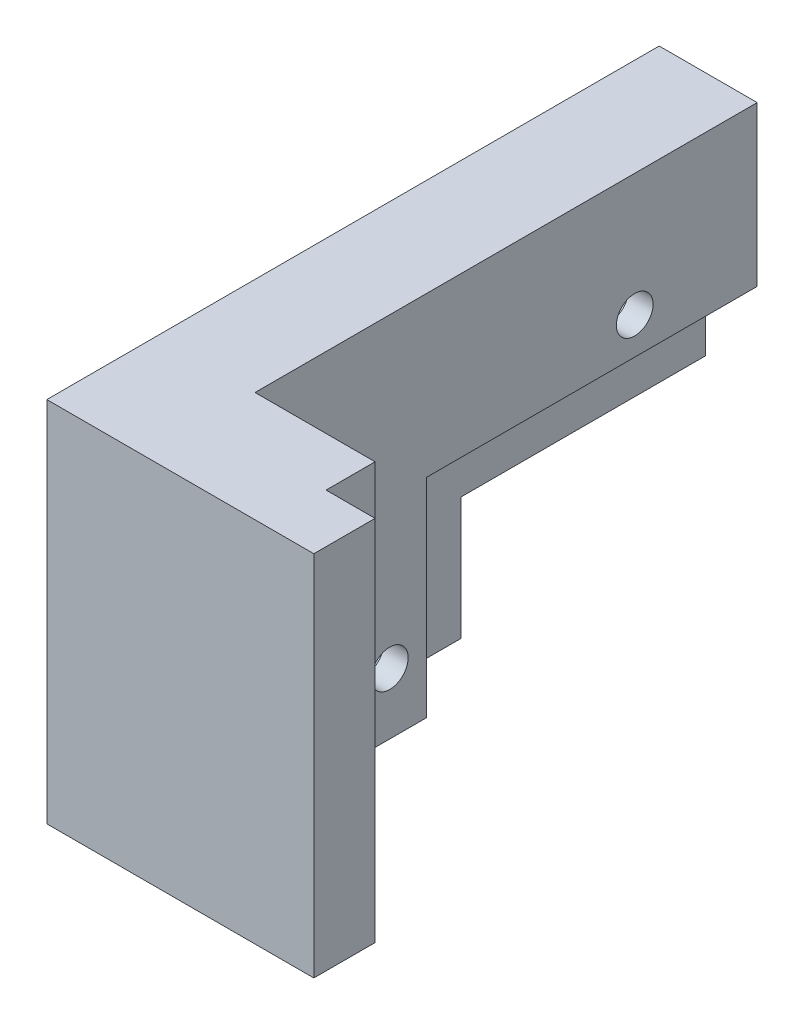
ISO-10303-21;
HEADER;
FILE_DESCRIPTION(('STEP AP214'),'2;1');
FILE_NAME('part.step','',(''),(''),'','','');
FILE_SCHEMA(('AUTOMOTIVE_DESIGN { 1 0 10303 214 1 1 1 1 }'));
ENDSEC;
DATA;
#1=APPLICATION_CONTEXT('core data for automotive mechanical design processes');
#2=APPLICATION_PROTOCOL_DEFINITION('international standard','automotive_design',2000,#1);
#3=PRODUCT_CONTEXT('',#1,'mechanical');
#4=PRODUCT('Part','Part','',(#3));
#5=PRODUCT_RELATED_PRODUCT_CATEGORY('part','',(#4));
#6=PRODUCT_DEFINITION_FORMATION('','',#4);
#7=PRODUCT_DEFINITION_CONTEXT('part definition',#1,'design');
#8=PRODUCT_DEFINITION('design','',#6,#7);
#9=PRODUCT_DEFINITION_SHAPE('','',#8);
#10=(LENGTH_UNIT() NAMED_UNIT(*) SI_UNIT(.MILLI.,.METRE.));
#11=(NAMED_UNIT(*) PLANE_ANGLE_UNIT() SI_UNIT($,.RADIAN.));
#12=(NAMED_UNIT(*) SI_UNIT($,.STERADIAN.) SOLID_ANGLE_UNIT());
#13=UNCERTAINTY_MEASURE_WITH_UNIT(LENGTH_MEASURE(1.E-05),#10,'distance_accuracy_value','');
#14=(GEOMETRIC_REPRESENTATION_CONTEXT(3) GLOBAL_UNCERTAINTY_ASSIGNED_CONTEXT((#13)) GLOBAL_UNIT_ASSIGNED_CONTEXT((#10,
#11,#12)) REPRESENTATION_CONTEXT('',''));
#15=CARTESIAN_POINT('',(0.,0.,0.));
#16=DIRECTION('',(0.,0.,1.));
#17=DIRECTION('',(1.,0.,0.));
#18=AXIS2_PLACEMENT_3D('',#15,#16,#17);
#19=CARTESIAN_POINT('',(0.,0.,0.));
#20=DIRECTION('',(0.,0.,1.));
#21=DIRECTION('',(1.,0.,0.));
#22=AXIS2_PLACEMENT_3D('',#19,#20,#21);
#23=PLANE('',#22);
#24=DIRECTION('',(0.,-1.,0.));
#25=VECTOR('',#24,1.);
#26=CARTESIAN_POINT('',(-26.2,0.,0.));
#27=LINE('',#26,#25);
#28=CARTESIAN_POINT('',(-26.2,30.,0.));
#29=VERTEX_POINT('',#28);
#30=CARTESIAN_POINT('',(-26.2,0.,0.));
#31=VERTEX_POINT('',#30);
#32=EDGE_CURVE('E136',#29,#31,#27,.T.);
#33=ORIENTED_EDGE('',*,*,#32,.T.);
#34=DIRECTION('',(1.,0.,0.));
#35=VECTOR('',#34,1.);
#36=CARTESIAN_POINT('',(0.,0.,0.));
#37=LINE('',#36,#35);
#38=CARTESIAN_POINT('',(-30.2,0.,0.));
#39=VERTEX_POINT('',#38);
#40=EDGE_CURVE('E151',#39,#31,#37,.T.);
#41=ORIENTED_EDGE('',*,*,#40,.F.);
#42=DIRECTION('',(0.,-1.,0.));
#43=VECTOR('',#42,1.);
#44=CARTESIAN_POINT('',(-30.2,30.,0.));
#45=LINE('',#44,#43);
#46=CARTESIAN_POINT('',(-30.2,30.,0.));
#47=VERTEX_POINT('',#46);
#48=EDGE_CURVE('E149',#47,#39,#45,.T.);
#49=ORIENTED_EDGE('',*,*,#48,.F.);
#50=DIRECTION('',(-1.,0.,0.));
#51=VECTOR('',#50,1.);
#52=CARTESIAN_POINT('',(0.,30.,0.));
#53=LINE('',#52,#51);
#54=EDGE_CURVE('E64',#29,#47,#53,.T.);
#55=ORIENTED_EDGE('',*,*,#54,.F.);
#56=EDGE_LOOP('',(#33,#41,#49,#55));
#57=FACE_BOUND('',#56,.T.);
#58=ADVANCED_FACE('F40',(#57),#23,.F.);
#59=CARTESIAN_POINT('',(0.,30.,5.));
#60=DIRECTION('',(0.,-1.,0.));
#61=DIRECTION('',(1.,0.,0.));
#62=AXIS2_PLACEMENT_3D('',#59,#60,#61);
#63=PLANE('',#62);
#64=DIRECTION('',(0.,0.,-1.));
#65=VECTOR('',#64,1.);
#66=CARTESIAN_POINT('',(-26.2,30.,0.));
#67=LINE('',#66,#65);
#68=CARTESIAN_POINT('',(-26.2,30.,5.));
#69=VERTEX_POINT('',#68);
#70=EDGE_CURVE('E57',#69,#29,#67,.T.);
#71=ORIENTED_EDGE('',*,*,#70,.T.);
#72=ORIENTED_EDGE('',*,*,#54,.T.);
#73=DIRECTION('',(0.,0.,1.));
#74=VECTOR('',#73,1.);
#75=CARTESIAN_POINT('',(-30.2,30.,0.));
#76=LINE('',#75,#74);
#77=CARTESIAN_POINT('',(-30.2,30.,-4.));
#78=VERTEX_POINT('',#77);
#79=EDGE_CURVE('E248',#78,#47,#76,.T.);
#80=ORIENTED_EDGE('',*,*,#79,.F.);
#81=DIRECTION('',(-1.,0.,0.));
#82=VECTOR('',#81,1.);
#83=CARTESIAN_POINT('',(-30.2,30.,-4.));
#84=LINE('',#83,#82);
#85=CARTESIAN_POINT('',(-40.,30.,-4.));
#86=VERTEX_POINT('',#85);
#87=EDGE_CURVE('E250',#78,#86,#84,.T.);
#88=ORIENTED_EDGE('',*,*,#87,.T.);
#89=DIRECTION('',(0.,0.,1.));
#90=VECTOR('',#89,1.);
#91=CARTESIAN_POINT('',(-40.,30.,-5.));
#92=LINE('',#91,#90);
#93=CARTESIAN_POINT('',(-40.,30.,-45.));
#94=VERTEX_POINT('',#93);
#95=EDGE_CURVE('E152',#94,#86,#92,.T.);
#96=ORIENTED_EDGE('',*,*,#95,.F.);
#97=DIRECTION('',(1.,0.,0.));
#98=VECTOR('',#97,1.);
#99=CARTESIAN_POINT('',(-48.,30.,-45.));
#100=LINE('',#99,#98);
#101=CARTESIAN_POINT('',(-48.,30.,-45.));
#102=VERTEX_POINT('',#101);
#103=EDGE_CURVE('E199',#102,#94,#100,.T.);
#104=ORIENTED_EDGE('',*,*,#103,.F.);
#105=DIRECTION('',(0.,0.,-1.));
#106=VECTOR('',#105,1.);
#107=CARTESIAN_POINT('',(-48.,30.,5.));
#108=LINE('',#107,#106);
#109=CARTESIAN_POINT('',(-48.,30.,5.));
#110=VERTEX_POINT('',#109);
#111=EDGE_CURVE('E182',#110,#102,#108,.T.);
#112=ORIENTED_EDGE('',*,*,#111,.F.);
#113=DIRECTION('',(-1.,0.,0.));
#114=VECTOR('',#113,1.);
#115=CARTESIAN_POINT('',(0.,30.,5.));
#116=LINE('',#115,#114);
#117=EDGE_CURVE('E49',#69,#110,#116,.T.);
#118=ORIENTED_EDGE('',*,*,#117,.F.);
#119=EDGE_LOOP('',(#71,#72,#80,#88,#96,#104,#112,#118));
#120=FACE_BOUND('',#119,.T.);
#121=ADVANCED_FACE('F42',(#120),#63,.F.);
#122=CARTESIAN_POINT('',(0.,0.,5.));
#123=DIRECTION('',(0.,1.,0.));
#124=DIRECTION('',(-1.,0.,0.));
#125=AXIS2_PLACEMENT_3D('',#122,#123,#124);
#126=PLANE('',#125);
#127=DIRECTION('',(0.,0.,1.));
#128=VECTOR('',#127,1.);
#129=CARTESIAN_POINT('',(-26.2,0.,5.));
#130=LINE('',#129,#128);
#131=CARTESIAN_POINT('',(-26.2,0.,5.));
#132=VERTEX_POINT('',#131);
#133=EDGE_CURVE('E139',#31,#132,#130,.T.);
#134=ORIENTED_EDGE('',*,*,#133,.T.);
#135=DIRECTION('',(1.,0.,0.));
#136=VECTOR('',#135,1.);
#137=CARTESIAN_POINT('',(0.,0.,5.));
#138=LINE('',#137,#136);
#139=CARTESIAN_POINT('',(-48.,0.,5.));
#140=VERTEX_POINT('',#139);
#141=EDGE_CURVE('E13',#140,#132,#138,.T.);
#142=ORIENTED_EDGE('',*,*,#141,.F.);
#143=DIRECTION('',(0.,0.,1.));
#144=VECTOR('',#143,1.);
#145=CARTESIAN_POINT('',(-48.,0.,-25.));
#146=LINE('',#145,#144);
#147=CARTESIAN_POINT('',(-48.,0.,-25.));
#148=VERTEX_POINT('',#147);
#149=EDGE_CURVE('E165',#148,#140,#146,.T.);
#150=ORIENTED_EDGE('',*,*,#149,.F.);
#151=DIRECTION('',(-1.,0.,0.));
#152=VECTOR('',#151,1.);
#153=CARTESIAN_POINT('',(-40.,0.,-25.));
#154=LINE('',#153,#152);
#155=CARTESIAN_POINT('',(-44.2,0.,-25.));
#156=VERTEX_POINT('',#155);
#157=EDGE_CURVE('E187',#156,#148,#154,.T.);
#158=ORIENTED_EDGE('',*,*,#157,.F.);
#159=DIRECTION('',(0.,0.,-1.));
#160=VECTOR('',#159,1.);
#161=CARTESIAN_POINT('',(-44.2,0.,-18.));
#162=LINE('',#161,#160);
#163=CARTESIAN_POINT('',(-44.2,0.,-18.));
#164=VERTEX_POINT('',#163);
#165=EDGE_CURVE('E238',#164,#156,#162,.T.);
#166=ORIENTED_EDGE('',*,*,#165,.F.);
#167=DIRECTION('',(1.,0.,0.));
#168=VECTOR('',#167,1.);
#169=CARTESIAN_POINT('',(-44.2,0.,-18.));
#170=LINE('',#169,#168);
#171=CARTESIAN_POINT('',(-40.,0.,-18.));
#172=VERTEX_POINT('',#171);
#173=EDGE_CURVE('E216',#164,#172,#170,.T.);
#174=ORIENTED_EDGE('',*,*,#173,.T.);
#175=DIRECTION('',(0.,0.,1.));
#176=VECTOR('',#175,1.);
#177=CARTESIAN_POINT('',(-40.,0.,-5.));
#178=LINE('',#177,#176);
#179=CARTESIAN_POINT('',(-40.,0.,-4.));
#180=VERTEX_POINT('',#179);
#181=EDGE_CURVE('E155',#172,#180,#178,.T.);
#182=ORIENTED_EDGE('',*,*,#181,.T.);
#183=DIRECTION('',(-1.,0.,0.));
#184=VECTOR('',#183,1.);
#185=CARTESIAN_POINT('',(-30.2,0.,-4.));
#186=LINE('',#185,#184);
#187=CARTESIAN_POINT('',(-30.2,0.,-4.));
#188=VERTEX_POINT('',#187);
#189=EDGE_CURVE('E254',#188,#180,#186,.T.);
#190=ORIENTED_EDGE('',*,*,#189,.F.);
#191=DIRECTION('',(0.,0.,-1.));
#192=VECTOR('',#191,1.);
#193=CARTESIAN_POINT('',(-30.2,0.,0.));
#194=LINE('',#193,#192);
#195=EDGE_CURVE('E244',#39,#188,#194,.T.);
#196=ORIENTED_EDGE('',*,*,#195,.F.);
#197=ORIENTED_EDGE('',*,*,#40,.T.);
#198=EDGE_LOOP('',(#134,#142,#150,#158,#166,#174,#182,#190,#196,#197));
#199=FACE_BOUND('',#198,.T.);
#200=ADVANCED_FACE('F236',(#199),#126,.F.);
#201=CARTESIAN_POINT('',(0.,0.,5.));
#202=DIRECTION('',(0.,0.,1.));
#203=DIRECTION('',(1.,0.,0.));
#204=AXIS2_PLACEMENT_3D('',#201,#202,#203);
#205=PLANE('',#204);
#206=ORIENTED_EDGE('',*,*,#141,.T.);
#207=DIRECTION('',(0.,1.,0.));
#208=VECTOR('',#207,1.);
#209=CARTESIAN_POINT('',(-26.2,30.,5.));
#210=LINE('',#209,#208);
#211=EDGE_CURVE('E146',#132,#69,#210,.T.);
#212=ORIENTED_EDGE('',*,*,#211,.T.);
#213=ORIENTED_EDGE('',*,*,#117,.T.);
#214=DIRECTION('',(0.,1.,0.));
#215=VECTOR('',#214,1.);
#216=CARTESIAN_POINT('',(-48.,0.,5.));
#217=LINE('',#216,#215);
#218=EDGE_CURVE('E179',#140,#110,#217,.T.);
#219=ORIENTED_EDGE('',*,*,#218,.F.);
#220=EDGE_LOOP('',(#206,#212,#213,#219));
#221=FACE_BOUND('',#220,.T.);
#222=ADVANCED_FACE('F192',(#221),#205,.T.);
#223=CARTESIAN_POINT('',(-40.,30.,-5.));
#224=DIRECTION('',(-1.,0.,0.));
#225=DIRECTION('',(0.,0.,1.));
#226=AXIS2_PLACEMENT_3D('',#223,#224,#225);
#227=PLANE('',#226);
#228=CARTESIAN_POINT('',(-40.,5.,-15.));
#229=DIRECTION('',(-1.,0.,0.));
#230=DIRECTION('',(0.,0.,1.));
#231=AXIS2_PLACEMENT_3D('',#228,#229,#230);
#232=CIRCLE('',#231,1.5);
#233=CARTESIAN_POINT('',(-40.,5.,-13.5));
#234=VERTEX_POINT('',#233);
#235=EDGE_CURVE('E160',#234,#234,#232,.T.);
#236=ORIENTED_EDGE('',*,*,#235,.T.);
#237=EDGE_LOOP('',(#236));
#238=FACE_BOUND('',#237,.T.);
#239=CARTESIAN_POINT('',(-40.,20.,-35.));
#240=DIRECTION('',(-1.,0.,0.));
#241=DIRECTION('',(0.,0.,1.));
#242=AXIS2_PLACEMENT_3D('',#239,#240,#241);
#243=CIRCLE('',#242,1.5);
#244=CARTESIAN_POINT('',(-40.,20.,-33.5));
#245=VERTEX_POINT('',#244);
#246=EDGE_CURVE('E263',#245,#245,#243,.T.);
#247=ORIENTED_EDGE('',*,*,#246,.T.);
#248=EDGE_LOOP('',(#247));
#249=FACE_BOUND('',#248,.T.);
#250=DIRECTION('',(0.,1.,0.));
#251=VECTOR('',#250,1.);
#252=CARTESIAN_POINT('',(-40.,30.,-4.));
#253=LINE('',#252,#251);
#254=EDGE_CURVE('E142',#180,#86,#253,.T.);
#255=ORIENTED_EDGE('',*,*,#254,.F.);
#256=ORIENTED_EDGE('',*,*,#181,.F.);
#257=DIRECTION('',(0.,-1.,0.));
#258=VECTOR('',#257,1.);
#259=CARTESIAN_POINT('',(-40.,10.,-18.));
#260=LINE('',#259,#258);
#261=CARTESIAN_POINT('',(-40.,17.,-18.));
#262=VERTEX_POINT('',#261);
#263=EDGE_CURVE('E271',#262,#172,#260,.T.);
#264=ORIENTED_EDGE('',*,*,#263,.F.);
#265=DIRECTION('',(0.,0.,1.));
#266=VECTOR('',#265,1.);
#267=CARTESIAN_POINT('',(-40.,17.,-45.));
#268=LINE('',#267,#266);
#269=CARTESIAN_POINT('',(-40.,17.,-45.));
#270=VERTEX_POINT('',#269);
#271=EDGE_CURVE('E266',#270,#262,#268,.T.);
#272=ORIENTED_EDGE('',*,*,#271,.F.);
#273=DIRECTION('',(0.,-1.,0.));
#274=VECTOR('',#273,1.);
#275=CARTESIAN_POINT('',(-40.,30.,-45.));
#276=LINE('',#275,#274);
#277=EDGE_CURVE('E205',#94,#270,#276,.T.);
#278=ORIENTED_EDGE('',*,*,#277,.F.);
#279=ORIENTED_EDGE('',*,*,#95,.T.);
#280=EDGE_LOOP('',(#255,#256,#264,#272,#278,#279));
#281=FACE_BOUND('',#280,.T.);
#282=ADVANCED_FACE('F291',(#238,#249,#281),#227,.F.);
#283=CARTESIAN_POINT('',(-33.8,20.,-35.));
#284=DIRECTION('',(-1.,0.,0.));
#285=DIRECTION('',(0.,0.,1.));
#286=AXIS2_PLACEMENT_3D('',#283,#284,#285);
#287=CYLINDRICAL_SURFACE('',#286,1.5);
#288=ORIENTED_EDGE('',*,*,#246,.F.);
#289=EDGE_LOOP('',(#288));
#290=FACE_BOUND('',#289,.T.);
#291=CARTESIAN_POINT('',(-42.,20.,-35.));
#292=DIRECTION('',(-1.,0.,0.));
#293=DIRECTION('',(0.,0.,1.));
#294=AXIS2_PLACEMENT_3D('',#291,#292,#293);
#295=CIRCLE('',#294,1.5);
#296=CARTESIAN_POINT('',(-42.,20.,-33.5));
#297=VERTEX_POINT('',#296);
#298=EDGE_CURVE('E44',#297,#297,#295,.F.);
#299=ORIENTED_EDGE('',*,*,#298,.F.);
#300=EDGE_LOOP('',(#299));
#301=FACE_BOUND('',#300,.T.);
#302=ADVANCED_FACE('F327',(#290,#301),#287,.F.);
#303=CARTESIAN_POINT('',(0.,0.,-25.));
#304=DIRECTION('',(0.,0.,-1.));
#305=DIRECTION('',(-1.,0.,0.));
#306=AXIS2_PLACEMENT_3D('',#303,#304,#305);
#307=PLANE('',#306);
#308=DIRECTION('',(-1.,0.,0.));
#309=VECTOR('',#308,1.);
#310=CARTESIAN_POINT('',(-48.,10.,-25.));
#311=LINE('',#310,#309);
#312=CARTESIAN_POINT('',(-44.2,10.,-25.));
#313=VERTEX_POINT('',#312);
#314=CARTESIAN_POINT('',(-48.,10.,-25.));
#315=VERTEX_POINT('',#314);
#316=EDGE_CURVE('E214',#313,#315,#311,.T.);
#317=ORIENTED_EDGE('',*,*,#316,.F.);
#318=DIRECTION('',(0.,1.,0.));
#319=VECTOR('',#318,1.);
#320=CARTESIAN_POINT('',(-44.2,10.,-25.));
#321=LINE('',#320,#319);
#322=EDGE_CURVE('E233',#156,#313,#321,.T.);
#323=ORIENTED_EDGE('',*,*,#322,.F.);
#324=ORIENTED_EDGE('',*,*,#157,.T.);
#325=DIRECTION('',(0.,-1.,0.));
#326=VECTOR('',#325,1.);
#327=CARTESIAN_POINT('',(-48.,30.,-25.));
#328=LINE('',#327,#326);
#329=EDGE_CURVE('E184',#315,#148,#328,.T.);
#330=ORIENTED_EDGE('',*,*,#329,.F.);
#331=EDGE_LOOP('',(#317,#323,#324,#330));
#332=FACE_BOUND('',#331,.T.);
#333=ADVANCED_FACE('F231',(#332),#307,.T.);
#334=CARTESIAN_POINT('',(-48.,10.,-45.));
#335=DIRECTION('',(0.,1.,0.));
#336=DIRECTION('',(-1.,0.,0.));
#337=AXIS2_PLACEMENT_3D('',#334,#335,#336);
#338=PLANE('',#337);
#339=DIRECTION('',(0.,0.,-1.));
#340=VECTOR('',#339,1.);
#341=CARTESIAN_POINT('',(-44.2,10.,-45.));
#342=LINE('',#341,#340);
#343=CARTESIAN_POINT('',(-44.2,10.,-45.));
#344=VERTEX_POINT('',#343);
#345=EDGE_CURVE('E228',#313,#344,#342,.T.);
#346=ORIENTED_EDGE('',*,*,#345,.F.);
#347=ORIENTED_EDGE('',*,*,#316,.T.);
#348=DIRECTION('',(0.,0.,1.));
#349=VECTOR('',#348,1.);
#350=CARTESIAN_POINT('',(-48.,10.,-45.));
#351=LINE('',#350,#349);
#352=CARTESIAN_POINT('',(-48.,10.,-45.));
#353=VERTEX_POINT('',#352);
#354=EDGE_CURVE('E173',#353,#315,#351,.T.);
#355=ORIENTED_EDGE('',*,*,#354,.F.);
#356=DIRECTION('',(-1.,0.,0.));
#357=VECTOR('',#356,1.);
#358=CARTESIAN_POINT('',(-48.,10.,-45.));
#359=LINE('',#358,#357);
#360=EDGE_CURVE('E211',#344,#353,#359,.T.);
#361=ORIENTED_EDGE('',*,*,#360,.F.);
#362=EDGE_LOOP('',(#346,#347,#355,#361));
#363=FACE_BOUND('',#362,.T.);
#364=ADVANCED_FACE('F226',(#363),#338,.F.);
#365=CARTESIAN_POINT('',(-35.,5.,-15.));
#366=DIRECTION('',(-1.,0.,0.));
#367=DIRECTION('',(0.,0.,1.));
#368=AXIS2_PLACEMENT_3D('',#365,#366,#367);
#369=CYLINDRICAL_SURFACE('',#368,1.5);
#370=ORIENTED_EDGE('',*,*,#235,.F.);
#371=EDGE_LOOP('',(#370));
#372=FACE_BOUND('',#371,.T.);
#373=CARTESIAN_POINT('',(-42.,5.,-15.));
#374=DIRECTION('',(-1.,0.,0.));
#375=DIRECTION('',(0.,0.,1.));
#376=AXIS2_PLACEMENT_3D('',#373,#374,#375);
#377=CIRCLE('',#376,1.5);
#378=CARTESIAN_POINT('',(-42.,5.,-13.5));
#379=VERTEX_POINT('',#378);
#380=EDGE_CURVE('E158',#379,#379,#377,.F.);
#381=ORIENTED_EDGE('',*,*,#380,.F.);
#382=EDGE_LOOP('',(#381));
#383=FACE_BOUND('',#382,.T.);
#384=ADVANCED_FACE('F343',(#372,#383),#369,.F.);
#385=CARTESIAN_POINT('',(-48.,0.,0.));
#386=DIRECTION('',(-1.,0.,0.));
#387=DIRECTION('',(0.,0.,1.));
#388=AXIS2_PLACEMENT_3D('',#385,#386,#387);
#389=PLANE('',#388);
#390=CARTESIAN_POINT('',(-48.,20.,-35.));
#391=DIRECTION('',(-1.,0.,0.));
#392=DIRECTION('',(0.,0.,1.));
#393=AXIS2_PLACEMENT_3D('',#390,#391,#392);
#394=CIRCLE('',#393,2.9);
#395=CARTESIAN_POINT('',(-48.,20.,-32.1));
#396=VERTEX_POINT('',#395);
#397=EDGE_CURVE('E257',#396,#396,#394,.T.);
#398=ORIENTED_EDGE('',*,*,#397,.F.);
#399=EDGE_LOOP('',(#398));
#400=FACE_BOUND('',#399,.T.);
#401=CARTESIAN_POINT('',(-48.,5.,-15.));
#402=DIRECTION('',(-1.,0.,0.));
#403=DIRECTION('',(0.,0.,1.));
#404=AXIS2_PLACEMENT_3D('',#401,#402,#403);
#405=CIRCLE('',#404,2.9);
#406=CARTESIAN_POINT('',(-48.,5.,-12.1));
#407=VERTEX_POINT('',#406);
#408=EDGE_CURVE('E168',#407,#407,#405,.T.);
#409=ORIENTED_EDGE('',*,*,#408,.F.);
#410=EDGE_LOOP('',(#409));
#411=FACE_BOUND('',#410,.T.);
#412=ORIENTED_EDGE('',*,*,#149,.T.);
#413=ORIENTED_EDGE('',*,*,#218,.T.);
#414=ORIENTED_EDGE('',*,*,#111,.T.);
#415=DIRECTION('',(0.,1.,0.));
#416=VECTOR('',#415,1.);
#417=CARTESIAN_POINT('',(-48.,30.,-45.));
#418=LINE('',#417,#416);
#419=EDGE_CURVE('E206',#353,#102,#418,.T.);
#420=ORIENTED_EDGE('',*,*,#419,.F.);
#421=ORIENTED_EDGE('',*,*,#354,.T.);
#422=ORIENTED_EDGE('',*,*,#329,.T.);
#423=EDGE_LOOP('',(#412,#413,#414,#420,#421,#422));
#424=FACE_BOUND('',#423,.T.);
#425=ADVANCED_FACE('F194',(#400,#411,#424),#389,.T.);
#426=CARTESIAN_POINT('',(-42.,30.,-5.));
#427=DIRECTION('',(-1.,0.,0.));
#428=DIRECTION('',(0.,0.,1.));
#429=AXIS2_PLACEMENT_3D('',#426,#427,#428);
#430=PLANE('',#429);
#431=CARTESIAN_POINT('',(-42.,5.,-15.));
#432=DIRECTION('',(-1.,0.,0.));
#433=DIRECTION('',(0.,0.,1.));
#434=AXIS2_PLACEMENT_3D('',#431,#432,#433);
#435=CIRCLE('',#434,2.9);
#436=CARTESIAN_POINT('',(-42.,5.,-12.1));
#437=VERTEX_POINT('',#436);
#438=EDGE_CURVE('E161',#437,#437,#435,.F.);
#439=ORIENTED_EDGE('',*,*,#438,.F.);
#440=EDGE_LOOP('',(#439));
#441=FACE_BOUND('',#440,.T.);
#442=ORIENTED_EDGE('',*,*,#380,.T.);
#443=EDGE_LOOP('',(#442));
#444=FACE_BOUND('',#443,.T.);
#445=ADVANCED_FACE('F342',(#441,#444),#430,.T.);
#446=CARTESIAN_POINT('',(-31.797561338236,5.,-15.));
#447=DIRECTION('',(-1.,0.,0.));
#448=DIRECTION('',(0.,0.,1.));
#449=AXIS2_PLACEMENT_3D('',#446,#447,#448);
#450=CYLINDRICAL_SURFACE('',#449,2.9);
#451=ORIENTED_EDGE('',*,*,#438,.T.);
#452=EDGE_LOOP('',(#451));
#453=FACE_BOUND('',#452,.T.);
#454=ORIENTED_EDGE('',*,*,#408,.T.);
#455=EDGE_LOOP('',(#454));
#456=FACE_BOUND('',#455,.T.);
#457=ADVANCED_FACE('F348',(#453,#456),#450,.F.);
#458=CARTESIAN_POINT('',(0.,0.,-45.));
#459=DIRECTION('',(0.,0.,1.));
#460=DIRECTION('',(1.,0.,0.));
#461=AXIS2_PLACEMENT_3D('',#458,#459,#460);
#462=PLANE('',#461);
#463=ORIENTED_EDGE('',*,*,#277,.T.);
#464=DIRECTION('',(1.,0.,0.));
#465=VECTOR('',#464,1.);
#466=CARTESIAN_POINT('',(-44.2,17.,-45.));
#467=LINE('',#466,#465);
#468=CARTESIAN_POINT('',(-44.2,17.,-45.));
#469=VERTEX_POINT('',#468);
#470=EDGE_CURVE('E219',#469,#270,#467,.T.);
#471=ORIENTED_EDGE('',*,*,#470,.F.);
#472=DIRECTION('',(0.,1.,0.));
#473=VECTOR('',#472,1.);
#474=CARTESIAN_POINT('',(-44.2,10.,-45.));
#475=LINE('',#474,#473);
#476=EDGE_CURVE('E267',#344,#469,#475,.T.);
#477=ORIENTED_EDGE('',*,*,#476,.F.);
#478=ORIENTED_EDGE('',*,*,#360,.T.);
#479=ORIENTED_EDGE('',*,*,#419,.T.);
#480=ORIENTED_EDGE('',*,*,#103,.T.);
#481=EDGE_LOOP('',(#463,#471,#477,#478,#479,#480));
#482=FACE_BOUND('',#481,.T.);
#483=ADVANCED_FACE('F208',(#482),#462,.F.);
#484=CARTESIAN_POINT('',(-44.2,10.,-18.));
#485=DIRECTION('',(0.,0.,1.));
#486=DIRECTION('',(1.,0.,0.));
#487=AXIS2_PLACEMENT_3D('',#484,#485,#486);
#488=PLANE('',#487);
#489=ORIENTED_EDGE('',*,*,#263,.T.);
#490=ORIENTED_EDGE('',*,*,#173,.F.);
#491=DIRECTION('',(0.,-1.,0.));
#492=VECTOR('',#491,1.);
#493=CARTESIAN_POINT('',(-44.2,10.,-18.));
#494=LINE('',#493,#492);
#495=CARTESIAN_POINT('',(-44.2,17.,-18.));
#496=VERTEX_POINT('',#495);
#497=EDGE_CURVE('E274',#496,#164,#494,.T.);
#498=ORIENTED_EDGE('',*,*,#497,.F.);
#499=DIRECTION('',(1.,0.,0.));
#500=VECTOR('',#499,1.);
#501=CARTESIAN_POINT('',(-44.2,17.,-18.));
#502=LINE('',#501,#500);
#503=EDGE_CURVE('E282',#496,#262,#502,.T.);
#504=ORIENTED_EDGE('',*,*,#503,.T.);
#505=EDGE_LOOP('',(#489,#490,#498,#504));
#506=FACE_BOUND('',#505,.T.);
#507=ADVANCED_FACE('F294',(#506),#488,.F.);
#508=CARTESIAN_POINT('',(-44.2,17.,-45.));
#509=DIRECTION('',(0.,1.,0.));
#510=DIRECTION('',(0.,0.,1.));
#511=AXIS2_PLACEMENT_3D('',#508,#509,#510);
#512=PLANE('',#511);
#513=ORIENTED_EDGE('',*,*,#271,.T.);
#514=ORIENTED_EDGE('',*,*,#503,.F.);
#515=DIRECTION('',(0.,0.,1.));
#516=VECTOR('',#515,1.);
#517=CARTESIAN_POINT('',(-44.2,17.,-45.));
#518=LINE('',#517,#516);
#519=EDGE_CURVE('E270',#469,#496,#518,.T.);
#520=ORIENTED_EDGE('',*,*,#519,.F.);
#521=ORIENTED_EDGE('',*,*,#470,.T.);
#522=EDGE_LOOP('',(#513,#514,#520,#521));
#523=FACE_BOUND('',#522,.T.);
#524=ADVANCED_FACE('F288',(#523),#512,.F.);
#525=CARTESIAN_POINT('',(-44.2,0.,0.));
#526=DIRECTION('',(1.,0.,0.));
#527=DIRECTION('',(0.,0.,-1.));
#528=AXIS2_PLACEMENT_3D('',#525,#526,#527);
#529=PLANE('',#528);
#530=ORIENTED_EDGE('',*,*,#476,.T.);
#531=ORIENTED_EDGE('',*,*,#519,.T.);
#532=ORIENTED_EDGE('',*,*,#497,.T.);
#533=ORIENTED_EDGE('',*,*,#165,.T.);
#534=ORIENTED_EDGE('',*,*,#322,.T.);
#535=ORIENTED_EDGE('',*,*,#345,.T.);
#536=EDGE_LOOP('',(#530,#531,#532,#533,#534,#535));
#537=FACE_BOUND('',#536,.T.);
#538=ADVANCED_FACE('F360',(#537),#529,.T.);
#539=CARTESIAN_POINT('',(-42.,30.,-5.));
#540=DIRECTION('',(-1.,0.,0.));
#541=DIRECTION('',(0.,0.,1.));
#542=AXIS2_PLACEMENT_3D('',#539,#540,#541);
#543=PLANE('',#542);
#544=CARTESIAN_POINT('',(-42.,20.,-35.));
#545=DIRECTION('',(-1.,0.,0.));
#546=DIRECTION('',(0.,0.,1.));
#547=AXIS2_PLACEMENT_3D('',#544,#545,#546);
#548=CIRCLE('',#547,2.9);
#549=CARTESIAN_POINT('',(-42.,20.,-32.1));
#550=VERTEX_POINT('',#549);
#551=EDGE_CURVE('E260',#550,#550,#548,.F.);
#552=ORIENTED_EDGE('',*,*,#551,.F.);
#553=EDGE_LOOP('',(#552));
#554=FACE_BOUND('',#553,.T.);
#555=ORIENTED_EDGE('',*,*,#298,.T.);
#556=EDGE_LOOP('',(#555));
#557=FACE_BOUND('',#556,.T.);
#558=ADVANCED_FACE('F364',(#554,#557),#543,.T.);
#559=CARTESIAN_POINT('',(-31.797561338236,20.,-35.));
#560=DIRECTION('',(-1.,0.,0.));
#561=DIRECTION('',(0.,0.,1.));
#562=AXIS2_PLACEMENT_3D('',#559,#560,#561);
#563=CYLINDRICAL_SURFACE('',#562,2.9);
#564=ORIENTED_EDGE('',*,*,#551,.T.);
#565=EDGE_LOOP('',(#564));
#566=FACE_BOUND('',#565,.T.);
#567=ORIENTED_EDGE('',*,*,#397,.T.);
#568=EDGE_LOOP('',(#567));
#569=FACE_BOUND('',#568,.T.);
#570=ADVANCED_FACE('F310',(#566,#569),#563,.F.);
#571=CARTESIAN_POINT('',(-30.2,30.,-4.));
#572=DIRECTION('',(0.,0.,1.));
#573=DIRECTION('',(0.,-1.,0.));
#574=AXIS2_PLACEMENT_3D('',#571,#572,#573);
#575=PLANE('',#574);
#576=ORIENTED_EDGE('',*,*,#254,.T.);
#577=ORIENTED_EDGE('',*,*,#87,.F.);
#578=DIRECTION('',(0.,1.,0.));
#579=VECTOR('',#578,1.);
#580=CARTESIAN_POINT('',(-30.2,30.,-4.));
#581=LINE('',#580,#579);
#582=EDGE_CURVE('E246',#188,#78,#581,.T.);
#583=ORIENTED_EDGE('',*,*,#582,.F.);
#584=ORIENTED_EDGE('',*,*,#189,.T.);
#585=EDGE_LOOP('',(#576,#577,#583,#584));
#586=FACE_BOUND('',#585,.T.);
#587=ADVANCED_FACE('F298',(#586),#575,.F.);
#588=CARTESIAN_POINT('',(-30.2,0.,0.));
#589=DIRECTION('',(1.,0.,0.));
#590=DIRECTION('',(0.,0.,-1.));
#591=AXIS2_PLACEMENT_3D('',#588,#589,#590);
#592=PLANE('',#591);
#593=ORIENTED_EDGE('',*,*,#48,.T.);
#594=ORIENTED_EDGE('',*,*,#195,.T.);
#595=ORIENTED_EDGE('',*,*,#582,.T.);
#596=ORIENTED_EDGE('',*,*,#79,.T.);
#597=EDGE_LOOP('',(#593,#594,#595,#596));
#598=FACE_BOUND('',#597,.T.);
#599=ADVANCED_FACE('F301',(#598),#592,.T.);
#600=CARTESIAN_POINT('',(-26.2,0.,0.));
#601=DIRECTION('',(1.,0.,0.));
#602=DIRECTION('',(0.,0.,-1.));
#603=AXIS2_PLACEMENT_3D('',#600,#601,#602);
#604=PLANE('',#603);
#605=ORIENTED_EDGE('',*,*,#133,.F.);
#606=ORIENTED_EDGE('',*,*,#32,.F.);
#607=ORIENTED_EDGE('',*,*,#70,.F.);
#608=ORIENTED_EDGE('',*,*,#211,.F.);
#609=EDGE_LOOP('',(#605,#606,#607,#608));
#610=FACE_BOUND('',#609,.T.);
#611=ADVANCED_FACE('F137',(#610),#604,.T.);
#612=CLOSED_SHELL('',(#58,#121,#200,#222,#282,#302,#333,#364,#384,#425,#445,#457,#483,#507,#524,
#538,#558,#570,#587,#599,#611));
#613=MANIFOLD_SOLID_BREP('B2',#612);
#614=ADVANCED_BREP_SHAPE_REPRESENTATION('',(#18,#613),#14);
#615=SHAPE_DEFINITION_REPRESENTATION(#9,#614);
ENDSEC;
END-ISO-10303-21;
